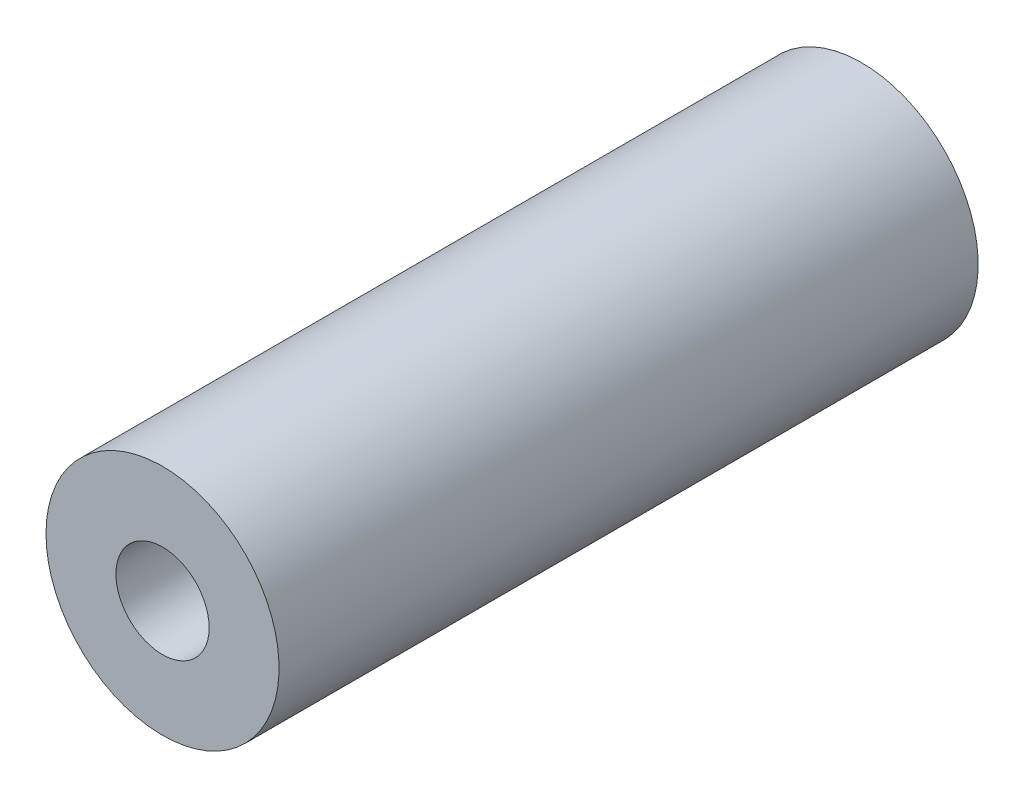
ISO-10303-21;
HEADER;
FILE_DESCRIPTION(('STEP AP214'),'2;1');
FILE_NAME('part.step','',(''),(''),'','','');
FILE_SCHEMA(('AUTOMOTIVE_DESIGN { 1 0 10303 214 1 1 1 1 }'));
ENDSEC;
DATA;
#1=APPLICATION_CONTEXT('core data for automotive mechanical design processes');
#2=APPLICATION_PROTOCOL_DEFINITION('international standard','automotive_design',2000,#1);
#3=PRODUCT_CONTEXT('',#1,'mechanical');
#4=PRODUCT('Part','Part','',(#3));
#5=PRODUCT_RELATED_PRODUCT_CATEGORY('part','',(#4));
#6=PRODUCT_DEFINITION_FORMATION('','',#4);
#7=PRODUCT_DEFINITION_CONTEXT('part definition',#1,'design');
#8=PRODUCT_DEFINITION('design','',#6,#7);
#9=PRODUCT_DEFINITION_SHAPE('','',#8);
#10=(LENGTH_UNIT() NAMED_UNIT(*) SI_UNIT(.MILLI.,.METRE.));
#11=(NAMED_UNIT(*) PLANE_ANGLE_UNIT() SI_UNIT($,.RADIAN.));
#12=(NAMED_UNIT(*) SI_UNIT($,.STERADIAN.) SOLID_ANGLE_UNIT());
#13=UNCERTAINTY_MEASURE_WITH_UNIT(LENGTH_MEASURE(1.E-05),#10,'distance_accuracy_value','');
#14=(GEOMETRIC_REPRESENTATION_CONTEXT(3) GLOBAL_UNCERTAINTY_ASSIGNED_CONTEXT((#13)) GLOBAL_UNIT_ASSIGNED_CONTEXT((#10,
#11,#12)) REPRESENTATION_CONTEXT('',''));
#15=CARTESIAN_POINT('',(0.,0.,0.));
#16=DIRECTION('',(0.,0.,1.));
#17=DIRECTION('',(1.,0.,0.));
#18=AXIS2_PLACEMENT_3D('',#15,#16,#17);
#19=CARTESIAN_POINT('',(0.,0.,76.2));
#20=DIRECTION('',(0.,0.,-1.));
#21=DIRECTION('',(-1.,0.,0.));
#22=AXIS2_PLACEMENT_3D('',#19,#20,#21);
#23=CYLINDRICAL_SURFACE('',#22,12.7);
#24=CARTESIAN_POINT('',(0.,0.,76.2));
#25=DIRECTION('',(0.,0.,1.));
#26=DIRECTION('',(1.,0.,0.));
#27=AXIS2_PLACEMENT_3D('',#24,#25,#26);
#28=CIRCLE('',#27,12.7);
#29=CARTESIAN_POINT('',(-12.7,0.,76.2));
#30=VERTEX_POINT('',#29);
#31=EDGE_CURVE('E10',#30,#30,#28,.T.);
#32=CARTESIAN_POINT('',(0.,0.,0.));
#33=DIRECTION('',(0.,0.,1.));
#34=DIRECTION('',(1.,0.,0.));
#35=AXIS2_PLACEMENT_3D('',#32,#33,#34);
#36=CIRCLE('',#35,12.7);
#37=CARTESIAN_POINT('',(-12.7,0.,0.));
#38=VERTEX_POINT('',#37);
#39=EDGE_CURVE('E44',#38,#38,#36,.T.);
#40=CARTESIAN_POINT('',(-12.7,0.,76.2));
#41=CARTESIAN_POINT('',(-12.7,0.,75.40625));
#42=CARTESIAN_POINT('',(-12.7,0.,74.6125));
#43=CARTESIAN_POINT('',(-12.7,0.,73.025));
#44=CARTESIAN_POINT('',(-12.7,0.,72.23125));
#45=CARTESIAN_POINT('',(-12.7,0.,70.64375));
#46=CARTESIAN_POINT('',(-12.7,0.,69.85));
#47=CARTESIAN_POINT('',(-12.7,0.,68.2625));
#48=CARTESIAN_POINT('',(-12.7,0.,67.46875));
#49=CARTESIAN_POINT('',(-12.7,0.,65.88125));
#50=CARTESIAN_POINT('',(-12.7,0.,65.0875));
#51=CARTESIAN_POINT('',(-12.7,0.,63.5));
#52=CARTESIAN_POINT('',(-12.7,0.,62.70625));
#53=CARTESIAN_POINT('',(-12.7,0.,61.11875));
#54=CARTESIAN_POINT('',(-12.7,0.,60.325));
#55=CARTESIAN_POINT('',(-12.7,0.,58.7375));
#56=CARTESIAN_POINT('',(-12.7,0.,57.94375));
#57=CARTESIAN_POINT('',(-12.7,0.,56.35625));
#58=CARTESIAN_POINT('',(-12.7,0.,55.5625));
#59=CARTESIAN_POINT('',(-12.7,0.,53.975));
#60=CARTESIAN_POINT('',(-12.7,0.,53.18125));
#61=CARTESIAN_POINT('',(-12.7,0.,51.59375));
#62=CARTESIAN_POINT('',(-12.7,0.,50.8));
#63=CARTESIAN_POINT('',(-12.7,0.,49.2125));
#64=CARTESIAN_POINT('',(-12.7,0.,48.41875));
#65=CARTESIAN_POINT('',(-12.7,0.,46.83125));
#66=CARTESIAN_POINT('',(-12.7,0.,46.0375));
#67=CARTESIAN_POINT('',(-12.7,0.,44.45));
#68=CARTESIAN_POINT('',(-12.7,0.,43.65625));
#69=CARTESIAN_POINT('',(-12.7,0.,42.06875));
#70=CARTESIAN_POINT('',(-12.7,0.,41.275));
#71=CARTESIAN_POINT('',(-12.7,0.,39.6875));
#72=CARTESIAN_POINT('',(-12.7,0.,38.89375));
#73=CARTESIAN_POINT('',(-12.7,0.,37.30625));
#74=CARTESIAN_POINT('',(-12.7,0.,36.5125));
#75=CARTESIAN_POINT('',(-12.7,0.,34.925));
#76=CARTESIAN_POINT('',(-12.7,0.,34.13125));
#77=CARTESIAN_POINT('',(-12.7,0.,32.54375));
#78=CARTESIAN_POINT('',(-12.7,0.,31.75));
#79=CARTESIAN_POINT('',(-12.7,0.,30.1625));
#80=CARTESIAN_POINT('',(-12.7,0.,29.36875));
#81=CARTESIAN_POINT('',(-12.7,0.,27.78125));
#82=CARTESIAN_POINT('',(-12.7,0.,26.9875));
#83=CARTESIAN_POINT('',(-12.7,0.,25.4));
#84=CARTESIAN_POINT('',(-12.7,0.,24.60625));
#85=CARTESIAN_POINT('',(-12.7,0.,23.01875));
#86=CARTESIAN_POINT('',(-12.7,0.,22.225));
#87=CARTESIAN_POINT('',(-12.7,0.,20.6375));
#88=CARTESIAN_POINT('',(-12.7,0.,19.84375));
#89=CARTESIAN_POINT('',(-12.7,0.,18.25625));
#90=CARTESIAN_POINT('',(-12.7,0.,17.4625));
#91=CARTESIAN_POINT('',(-12.7,0.,15.875));
#92=CARTESIAN_POINT('',(-12.7,0.,15.08125));
#93=CARTESIAN_POINT('',(-12.7,0.,13.49375));
#94=CARTESIAN_POINT('',(-12.7,0.,12.7));
#95=CARTESIAN_POINT('',(-12.7,0.,11.1125));
#96=CARTESIAN_POINT('',(-12.7,0.,10.31875));
#97=CARTESIAN_POINT('',(-12.7,0.,8.73125));
#98=CARTESIAN_POINT('',(-12.7,0.,7.93750000000001));
#99=CARTESIAN_POINT('',(-12.7,0.,6.35));
#100=CARTESIAN_POINT('',(-12.7,0.,5.55625));
#101=CARTESIAN_POINT('',(-12.7,0.,3.96875));
#102=CARTESIAN_POINT('',(-12.7,0.,3.175));
#103=CARTESIAN_POINT('',(-12.7,0.,1.5875));
#104=CARTESIAN_POINT('',(-12.7,0.,0.793750000000001));
#105=CARTESIAN_POINT('',(-12.7,0.,0.));
#106=B_SPLINE_CURVE_WITH_KNOTS('',3,(#40,#41,#42,#43,#44,#45,#46,#47,#48,#49,#50,#51,#52,#53,
#54,#55,#56,#57,#58,#59,#60,#61,#62,#63,#64,#65,#66,#67,#68,#69,#70,#71,#72,#73,#74,#75,#76,#77,
#78,#79,#80,#81,#82,#83,#84,#85,#86,#87,#88,#89,#90,#91,#92,#93,#94,#95,#96,#97,#98,#99,#100,
#101,#102,#103,#104,#105),.UNSPECIFIED.,.F.,.F.,(4,2,2,2,2,2,2,2,2,2,2,2,2,2,2,2,2,2,2,2,2,2,2,
2,2,2,2,2,2,2,2,2,4),(0.,2.38124999999999,4.76249999999999,7.14374999999999,9.52499999999999,
11.90625,14.2875,16.66875,19.05,21.43125,23.8125,26.19375,28.575,30.95625,33.3375,35.71875,38.1,
40.48125,42.8625,45.24375,47.625,50.00625,52.3875,54.76875,57.15,59.53125,61.9125,64.29375,
66.675,69.05625,71.4375,73.81875,76.2),.UNSPECIFIED.);
#107=EDGE_CURVE('BSEAM41',#30,#38,#106,.T.);
#108=ORIENTED_EDGE('',*,*,#31,.F.);
#109=ORIENTED_EDGE('',*,*,#39,.T.);
#110=ORIENTED_EDGE('',*,*,#107,.T.);
#111=ORIENTED_EDGE('',*,*,#107,.F.);
#112=EDGE_LOOP('',(#108,#110,#109,#111));
#113=FACE_BOUND('',#112,.T.);
#114=ADVANCED_FACE('F41',(#113),#23,.T.);
#115=CARTESIAN_POINT('',(0.,0.,76.2));
#116=DIRECTION('',(0.,0.,1.));
#117=DIRECTION('',(1.,0.,0.));
#118=AXIS2_PLACEMENT_3D('',#115,#116,#117);
#119=PLANE('',#118);
#120=CARTESIAN_POINT('',(0.,0.,76.2));
#121=DIRECTION('',(0.,0.,1.));
#122=DIRECTION('',(1.,0.,0.));
#123=AXIS2_PLACEMENT_3D('',#120,#121,#122);
#124=CIRCLE('',#123,5.08);
#125=CARTESIAN_POINT('',(5.08,0.,76.2));
#126=VERTEX_POINT('',#125);
#127=EDGE_CURVE('E55',#126,#126,#124,.T.);
#128=ORIENTED_EDGE('',*,*,#127,.F.);
#129=EDGE_LOOP('',(#128));
#130=FACE_BOUND('',#129,.T.);
#131=ORIENTED_EDGE('',*,*,#31,.T.);
#132=EDGE_LOOP('',(#131));
#133=FACE_BOUND('',#132,.T.);
#134=ADVANCED_FACE('F72',(#130,#133),#119,.T.);
#135=CARTESIAN_POINT('',(0.,0.,0.));
#136=DIRECTION('',(0.,0.,1.));
#137=DIRECTION('',(1.,0.,0.));
#138=AXIS2_PLACEMENT_3D('',#135,#136,#137);
#139=PLANE('',#138);
#140=ORIENTED_EDGE('',*,*,#39,.F.);
#141=EDGE_LOOP('',(#140));
#142=FACE_BOUND('',#141,.T.);
#143=ADVANCED_FACE('F68',(#142),#139,.F.);
#144=CARTESIAN_POINT('',(0.,0.,63.5));
#145=DIRECTION('',(0.,0.,1.));
#146=DIRECTION('',(1.,0.,0.));
#147=AXIS2_PLACEMENT_3D('',#144,#145,#146);
#148=CYLINDRICAL_SURFACE('',#147,5.08);
#149=CARTESIAN_POINT('',(0.,0.,63.5));
#150=DIRECTION('',(0.,0.,1.));
#151=DIRECTION('',(1.,0.,0.));
#152=AXIS2_PLACEMENT_3D('',#149,#150,#151);
#153=CIRCLE('',#152,5.08);
#154=CARTESIAN_POINT('',(5.08,0.,63.5));
#155=VERTEX_POINT('',#154);
#156=EDGE_CURVE('E53',#155,#155,#153,.T.);
#157=ORIENTED_EDGE('',*,*,#156,.F.);
#158=EDGE_LOOP('',(#157));
#159=FACE_BOUND('',#158,.T.);
#160=ORIENTED_EDGE('',*,*,#127,.T.);
#161=EDGE_LOOP('',(#160));
#162=FACE_BOUND('',#161,.T.);
#163=ADVANCED_FACE('F65',(#159,#162),#148,.F.);
#164=CARTESIAN_POINT('',(0.,0.,63.5));
#165=DIRECTION('',(0.,0.,1.));
#166=DIRECTION('',(1.,0.,0.));
#167=AXIS2_PLACEMENT_3D('',#164,#165,#166);
#168=PLANE('',#167);
#169=ORIENTED_EDGE('',*,*,#156,.T.);
#170=EDGE_LOOP('',(#169));
#171=FACE_BOUND('',#170,.T.);
#172=ADVANCED_FACE('F63',(#171),#168,.T.);
#173=CLOSED_SHELL('',(#114,#134,#143,#163,#172));
#174=MANIFOLD_SOLID_BREP('B2',#173);
#175=ADVANCED_BREP_SHAPE_REPRESENTATION('',(#18,#174),#14);
#176=SHAPE_DEFINITION_REPRESENTATION(#9,#175);
ENDSEC;
END-ISO-10303-21;
